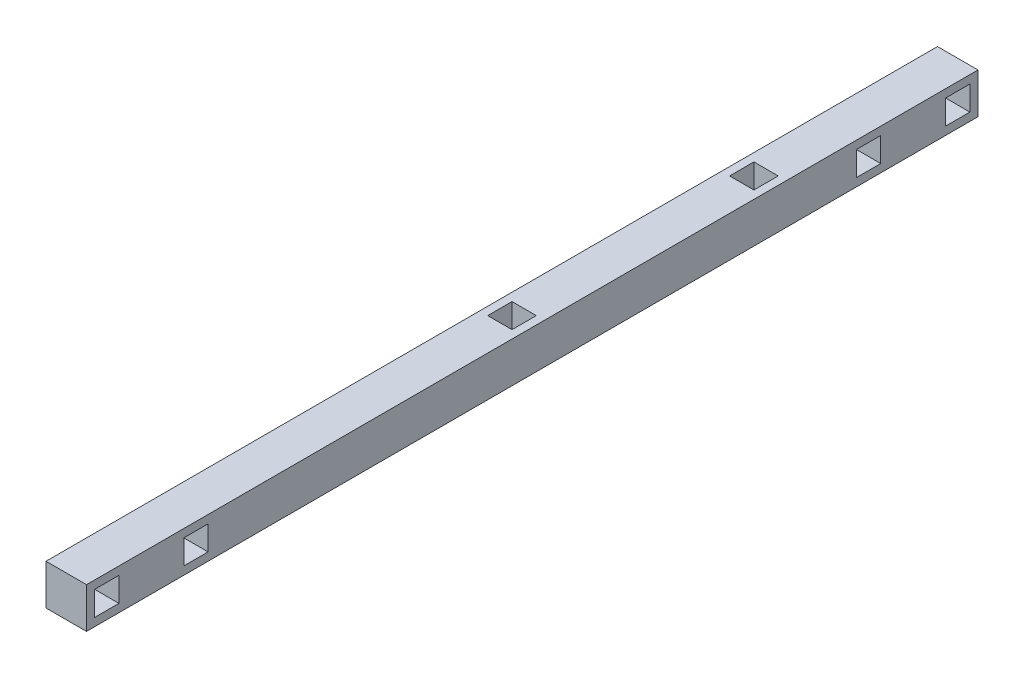
ISO-10303-21;
HEADER;
FILE_DESCRIPTION(('STEP AP214'),'2;1');
FILE_NAME('part.step','',(''),(''),'','','');
FILE_SCHEMA(('AUTOMOTIVE_DESIGN { 1 0 10303 214 1 1 1 1 }'));
ENDSEC;
DATA;
#1=APPLICATION_CONTEXT('core data for automotive mechanical design processes');
#2=APPLICATION_PROTOCOL_DEFINITION('international standard','automotive_design',2000,#1);
#3=PRODUCT_CONTEXT('',#1,'mechanical');
#4=PRODUCT('Part','Part','',(#3));
#5=PRODUCT_RELATED_PRODUCT_CATEGORY('part','',(#4));
#6=PRODUCT_DEFINITION_FORMATION('','',#4);
#7=PRODUCT_DEFINITION_CONTEXT('part definition',#1,'design');
#8=PRODUCT_DEFINITION('design','',#6,#7);
#9=PRODUCT_DEFINITION_SHAPE('','',#8);
#10=(LENGTH_UNIT() NAMED_UNIT(*) SI_UNIT(.MILLI.,.METRE.));
#11=(NAMED_UNIT(*) PLANE_ANGLE_UNIT() SI_UNIT($,.RADIAN.));
#12=(NAMED_UNIT(*) SI_UNIT($,.STERADIAN.) SOLID_ANGLE_UNIT());
#13=UNCERTAINTY_MEASURE_WITH_UNIT(LENGTH_MEASURE(1.E-05),#10,'distance_accuracy_value','');
#14=(GEOMETRIC_REPRESENTATION_CONTEXT(3) GLOBAL_UNCERTAINTY_ASSIGNED_CONTEXT((#13)) GLOBAL_UNIT_ASSIGNED_CONTEXT((#10,
#11,#12)) REPRESENTATION_CONTEXT('',''));
#15=CARTESIAN_POINT('',(0.,0.,0.));
#16=DIRECTION('',(0.,0.,1.));
#17=DIRECTION('',(1.,0.,0.));
#18=AXIS2_PLACEMENT_3D('',#15,#16,#17);
#19=CARTESIAN_POINT('',(0.,0.,110.));
#20=DIRECTION('',(1.,0.,0.));
#21=DIRECTION('',(0.,0.,-1.));
#22=AXIS2_PLACEMENT_3D('',#19,#20,#21);
#23=PLANE('',#22);
#24=DIRECTION('',(0.,0.,1.));
#25=VECTOR('',#24,1.);
#26=CARTESIAN_POINT('',(0.,1.,1.));
#27=LINE('',#26,#25);
#28=CARTESIAN_POINT('',(0.,1.,1.));
#29=VERTEX_POINT('',#28);
#30=CARTESIAN_POINT('',(0.,1.,4.));
#31=VERTEX_POINT('',#30);
#32=EDGE_CURVE('E289',#29,#31,#27,.T.);
#33=ORIENTED_EDGE('',*,*,#32,.F.);
#34=DIRECTION('',(0.,-1.,0.));
#35=VECTOR('',#34,1.);
#36=CARTESIAN_POINT('',(0.,1.,1.));
#37=LINE('',#36,#35);
#38=CARTESIAN_POINT('',(0.,4.,1.));
#39=VERTEX_POINT('',#38);
#40=EDGE_CURVE('E287',#39,#29,#37,.T.);
#41=ORIENTED_EDGE('',*,*,#40,.F.);
#42=DIRECTION('',(0.,0.,-1.));
#43=VECTOR('',#42,1.);
#44=CARTESIAN_POINT('',(0.,4.,1.));
#45=LINE('',#44,#43);
#46=CARTESIAN_POINT('',(0.,4.,4.));
#47=VERTEX_POINT('',#46);
#48=EDGE_CURVE('E296',#47,#39,#45,.T.);
#49=ORIENTED_EDGE('',*,*,#48,.F.);
#50=DIRECTION('',(0.,1.,0.));
#51=VECTOR('',#50,1.);
#52=CARTESIAN_POINT('',(0.,1.,4.));
#53=LINE('',#52,#51);
#54=EDGE_CURVE('E293',#31,#47,#53,.T.);
#55=ORIENTED_EDGE('',*,*,#54,.F.);
#56=EDGE_LOOP('',(#33,#41,#49,#55));
#57=FACE_BOUND('',#56,.T.);
#58=DIRECTION('',(0.,0.,-1.));
#59=VECTOR('',#58,1.);
#60=CARTESIAN_POINT('',(0.,4.00000000000001,98.));
#61=LINE('',#60,#59);
#62=CARTESIAN_POINT('',(0.,4.00000000000001,98.));
#63=VERTEX_POINT('',#62);
#64=CARTESIAN_POINT('',(0.,4.00000000000001,95.));
#65=VERTEX_POINT('',#64);
#66=EDGE_CURVE('E310',#63,#65,#61,.T.);
#67=ORIENTED_EDGE('',*,*,#66,.F.);
#68=DIRECTION('',(0.,1.,0.));
#69=VECTOR('',#68,1.);
#70=CARTESIAN_POINT('',(0.,4.00000000000001,98.));
#71=LINE('',#70,#69);
#72=CARTESIAN_POINT('',(0.,1.00000000000001,98.));
#73=VERTEX_POINT('',#72);
#74=EDGE_CURVE('E286',#73,#63,#71,.T.);
#75=ORIENTED_EDGE('',*,*,#74,.F.);
#76=DIRECTION('',(0.,0.,1.));
#77=VECTOR('',#76,1.);
#78=CARTESIAN_POINT('',(0.,1.00000000000001,98.));
#79=LINE('',#78,#77);
#80=CARTESIAN_POINT('',(0.,1.00000000000001,95.));
#81=VERTEX_POINT('',#80);
#82=EDGE_CURVE('E316',#81,#73,#79,.T.);
#83=ORIENTED_EDGE('',*,*,#82,.F.);
#84=DIRECTION('',(0.,-1.,0.));
#85=VECTOR('',#84,1.);
#86=CARTESIAN_POINT('',(0.,4.00000000000001,95.));
#87=LINE('',#86,#85);
#88=EDGE_CURVE('E313',#65,#81,#87,.T.);
#89=ORIENTED_EDGE('',*,*,#88,.F.);
#90=EDGE_LOOP('',(#67,#75,#83,#89));
#91=FACE_BOUND('',#90,.T.);
#92=DIRECTION('',(0.,0.,1.));
#93=VECTOR('',#92,1.);
#94=CARTESIAN_POINT('',(0.,1.,12.));
#95=LINE('',#94,#93);
#96=CARTESIAN_POINT('',(0.,1.,12.));
#97=VERTEX_POINT('',#96);
#98=CARTESIAN_POINT('',(0.,1.,15.));
#99=VERTEX_POINT('',#98);
#100=EDGE_CURVE('E350',#97,#99,#95,.T.);
#101=ORIENTED_EDGE('',*,*,#100,.F.);
#102=DIRECTION('',(0.,-1.,0.));
#103=VECTOR('',#102,1.);
#104=CARTESIAN_POINT('',(0.,4.,12.));
#105=LINE('',#104,#103);
#106=CARTESIAN_POINT('',(0.,4.,12.));
#107=VERTEX_POINT('',#106);
#108=EDGE_CURVE('E322',#107,#97,#105,.T.);
#109=ORIENTED_EDGE('',*,*,#108,.F.);
#110=DIRECTION('',(0.,0.,-1.));
#111=VECTOR('',#110,1.);
#112=CARTESIAN_POINT('',(0.,4.,12.));
#113=LINE('',#112,#111);
#114=CARTESIAN_POINT('',(0.,4.,15.));
#115=VERTEX_POINT('',#114);
#116=EDGE_CURVE('E356',#115,#107,#113,.T.);
#117=ORIENTED_EDGE('',*,*,#116,.F.);
#118=DIRECTION('',(0.,1.,0.));
#119=VECTOR('',#118,1.);
#120=CARTESIAN_POINT('',(0.,4.,15.));
#121=LINE('',#120,#119);
#122=EDGE_CURVE('E353',#99,#115,#121,.T.);
#123=ORIENTED_EDGE('',*,*,#122,.F.);
#124=EDGE_LOOP('',(#101,#109,#117,#123));
#125=FACE_BOUND('',#124,.T.);
#126=DIRECTION('',(0.,0.,-1.));
#127=VECTOR('',#126,1.);
#128=CARTESIAN_POINT('',(0.,4.,109.));
#129=LINE('',#128,#127);
#130=CARTESIAN_POINT('',(0.,4.,109.));
#131=VERTEX_POINT('',#130);
#132=CARTESIAN_POINT('',(0.,4.,106.));
#133=VERTEX_POINT('',#132);
#134=EDGE_CURVE('E331',#131,#133,#129,.T.);
#135=ORIENTED_EDGE('',*,*,#134,.F.);
#136=DIRECTION('',(0.,1.,0.));
#137=VECTOR('',#136,1.);
#138=CARTESIAN_POINT('',(0.,4.,109.));
#139=LINE('',#138,#137);
#140=CARTESIAN_POINT('',(0.,1.,109.));
#141=VERTEX_POINT('',#140);
#142=EDGE_CURVE('E329',#141,#131,#139,.T.);
#143=ORIENTED_EDGE('',*,*,#142,.F.);
#144=DIRECTION('',(0.,0.,1.));
#145=VECTOR('',#144,1.);
#146=CARTESIAN_POINT('',(0.,1.,109.));
#147=LINE('',#146,#145);
#148=CARTESIAN_POINT('',(0.,1.,106.));
#149=VERTEX_POINT('',#148);
#150=EDGE_CURVE('E338',#149,#141,#147,.T.);
#151=ORIENTED_EDGE('',*,*,#150,.F.);
#152=DIRECTION('',(0.,-1.,0.));
#153=VECTOR('',#152,1.);
#154=CARTESIAN_POINT('',(0.,4.,106.));
#155=LINE('',#154,#153);
#156=EDGE_CURVE('E335',#133,#149,#155,.T.);
#157=ORIENTED_EDGE('',*,*,#156,.F.);
#158=EDGE_LOOP('',(#135,#143,#151,#157));
#159=FACE_BOUND('',#158,.T.);
#160=DIRECTION('',(0.,-1.,0.));
#161=VECTOR('',#160,1.);
#162=CARTESIAN_POINT('',(0.,0.,0.));
#163=LINE('',#162,#161);
#164=CARTESIAN_POINT('',(0.,5.,0.));
#165=VERTEX_POINT('',#164);
#166=CARTESIAN_POINT('',(0.,0.,0.));
#167=VERTEX_POINT('',#166);
#168=EDGE_CURVE('E302',#165,#167,#163,.T.);
#169=ORIENTED_EDGE('',*,*,#168,.T.);
#170=DIRECTION('',(0.,0.,-1.));
#171=VECTOR('',#170,1.);
#172=CARTESIAN_POINT('',(0.,0.,110.));
#173=LINE('',#172,#171);
#174=CARTESIAN_POINT('',(0.,0.,110.));
#175=VERTEX_POINT('',#174);
#176=EDGE_CURVE('E393',#175,#167,#173,.T.);
#177=ORIENTED_EDGE('',*,*,#176,.F.);
#178=DIRECTION('',(0.,-1.,0.));
#179=VECTOR('',#178,1.);
#180=CARTESIAN_POINT('',(0.,0.,110.));
#181=LINE('',#180,#179);
#182=CARTESIAN_POINT('',(0.,5.,110.));
#183=VERTEX_POINT('',#182);
#184=EDGE_CURVE('E367',#183,#175,#181,.T.);
#185=ORIENTED_EDGE('',*,*,#184,.F.);
#186=DIRECTION('',(0.,0.,-1.));
#187=VECTOR('',#186,1.);
#188=CARTESIAN_POINT('',(0.,5.,110.));
#189=LINE('',#188,#187);
#190=EDGE_CURVE('E377',#183,#165,#189,.T.);
#191=ORIENTED_EDGE('',*,*,#190,.T.);
#192=EDGE_LOOP('',(#169,#177,#185,#191));
#193=FACE_BOUND('',#192,.T.);
#194=ADVANCED_FACE('F32',(#57,#91,#125,#159,#193),#23,.F.);
#195=CARTESIAN_POINT('',(0.,0.,110.));
#196=DIRECTION('',(0.,1.,0.));
#197=DIRECTION('',(0.,0.,1.));
#198=AXIS2_PLACEMENT_3D('',#195,#196,#197);
#199=PLANE('',#198);
#200=DIRECTION('',(-1.,0.,0.));
#201=VECTOR('',#200,1.);
#202=CARTESIAN_POINT('',(0.,0.,23.65));
#203=LINE('',#202,#201);
#204=CARTESIAN_POINT('',(4.,0.,23.65));
#205=VERTEX_POINT('',#204);
#206=CARTESIAN_POINT('',(0.999999999999999,0.,23.65));
#207=VERTEX_POINT('',#206);
#208=EDGE_CURVE('E280',#205,#207,#203,.T.);
#209=ORIENTED_EDGE('',*,*,#208,.T.);
#210=DIRECTION('',(0.,0.,1.));
#211=VECTOR('',#210,1.);
#212=CARTESIAN_POINT('',(1.00000000000001,0.,110.));
#213=LINE('',#212,#211);
#214=CARTESIAN_POINT('',(0.999999999999999,0.,26.65));
#215=VERTEX_POINT('',#214);
#216=EDGE_CURVE('E283',#207,#215,#213,.T.);
#217=ORIENTED_EDGE('',*,*,#216,.T.);
#218=DIRECTION('',(1.,0.,0.));
#219=VECTOR('',#218,1.);
#220=CARTESIAN_POINT('',(0.,0.,26.65));
#221=LINE('',#220,#219);
#222=CARTESIAN_POINT('',(4.,0.,26.65));
#223=VERTEX_POINT('',#222);
#224=EDGE_CURVE('E277',#215,#223,#221,.T.);
#225=ORIENTED_EDGE('',*,*,#224,.T.);
#226=DIRECTION('',(0.,0.,-1.));
#227=VECTOR('',#226,1.);
#228=CARTESIAN_POINT('',(4.00000000000005,0.,110.));
#229=LINE('',#228,#227);
#230=EDGE_CURVE('E221',#223,#205,#229,.T.);
#231=ORIENTED_EDGE('',*,*,#230,.T.);
#232=EDGE_LOOP('',(#209,#217,#225,#231));
#233=FACE_BOUND('',#232,.T.);
#234=DIRECTION('',(-1.,0.,0.));
#235=VECTOR('',#234,1.);
#236=CARTESIAN_POINT('',(0.,0.,53.5));
#237=LINE('',#236,#235);
#238=CARTESIAN_POINT('',(4.,0.,53.5));
#239=VERTEX_POINT('',#238);
#240=CARTESIAN_POINT('',(1.,0.,53.5));
#241=VERTEX_POINT('',#240);
#242=EDGE_CURVE('E271',#239,#241,#237,.T.);
#243=ORIENTED_EDGE('',*,*,#242,.T.);
#244=DIRECTION('',(0.,0.,1.));
#245=VECTOR('',#244,1.);
#246=CARTESIAN_POINT('',(1.,0.,110.));
#247=LINE('',#246,#245);
#248=CARTESIAN_POINT('',(1.,0.,56.5));
#249=VERTEX_POINT('',#248);
#250=EDGE_CURVE('E274',#241,#249,#247,.T.);
#251=ORIENTED_EDGE('',*,*,#250,.T.);
#252=DIRECTION('',(1.,0.,0.));
#253=VECTOR('',#252,1.);
#254=CARTESIAN_POINT('',(0.,0.,56.5));
#255=LINE('',#254,#253);
#256=CARTESIAN_POINT('',(4.,0.,56.5));
#257=VERTEX_POINT('',#256);
#258=EDGE_CURVE('E245',#249,#257,#255,.T.);
#259=ORIENTED_EDGE('',*,*,#258,.T.);
#260=DIRECTION('',(0.,0.,-1.));
#261=VECTOR('',#260,1.);
#262=CARTESIAN_POINT('',(4.,0.,110.));
#263=LINE('',#262,#261);
#264=EDGE_CURVE('E268',#257,#239,#263,.T.);
#265=ORIENTED_EDGE('',*,*,#264,.T.);
#266=EDGE_LOOP('',(#243,#251,#259,#265));
#267=FACE_BOUND('',#266,.T.);
#268=DIRECTION('',(1.,0.,0.));
#269=VECTOR('',#268,1.);
#270=CARTESIAN_POINT('',(0.,0.,0.));
#271=LINE('',#270,#269);
#272=CARTESIAN_POINT('',(5.,0.,0.));
#273=VERTEX_POINT('',#272);
#274=EDGE_CURVE('E380',#167,#273,#271,.T.);
#275=ORIENTED_EDGE('',*,*,#274,.T.);
#276=DIRECTION('',(0.,0.,-1.));
#277=VECTOR('',#276,1.);
#278=CARTESIAN_POINT('',(5.,0.,110.));
#279=LINE('',#278,#277);
#280=CARTESIAN_POINT('',(5.,0.,110.));
#281=VERTEX_POINT('',#280);
#282=EDGE_CURVE('E390',#281,#273,#279,.T.);
#283=ORIENTED_EDGE('',*,*,#282,.F.);
#284=DIRECTION('',(1.,0.,0.));
#285=VECTOR('',#284,1.);
#286=CARTESIAN_POINT('',(0.,0.,110.));
#287=LINE('',#286,#285);
#288=EDGE_CURVE('E370',#175,#281,#287,.T.);
#289=ORIENTED_EDGE('',*,*,#288,.F.);
#290=ORIENTED_EDGE('',*,*,#176,.T.);
#291=EDGE_LOOP('',(#275,#283,#289,#290));
#292=FACE_BOUND('',#291,.T.);
#293=ADVANCED_FACE('F472',(#233,#267,#292),#199,.F.);
#294=CARTESIAN_POINT('',(5.,0.,110.));
#295=DIRECTION('',(-1.,0.,0.));
#296=DIRECTION('',(0.,0.,1.));
#297=AXIS2_PLACEMENT_3D('',#294,#295,#296);
#298=PLANE('',#297);
#299=DIRECTION('',(0.,0.,-1.));
#300=VECTOR('',#299,1.);
#301=CARTESIAN_POINT('',(5.,4.,110.));
#302=LINE('',#301,#300);
#303=CARTESIAN_POINT('',(5.,4.,4.));
#304=VERTEX_POINT('',#303);
#305=CARTESIAN_POINT('',(5.,4.,1.));
#306=VERTEX_POINT('',#305);
#307=EDGE_CURVE('E39',#304,#306,#302,.T.);
#308=ORIENTED_EDGE('',*,*,#307,.T.);
#309=DIRECTION('',(0.,-1.,0.));
#310=VECTOR('',#309,1.);
#311=CARTESIAN_POINT('',(5.,0.,1.));
#312=LINE('',#311,#310);
#313=CARTESIAN_POINT('',(5.,1.,1.));
#314=VERTEX_POINT('',#313);
#315=EDGE_CURVE('E11',#306,#314,#312,.T.);
#316=ORIENTED_EDGE('',*,*,#315,.T.);
#317=DIRECTION('',(0.,0.,1.));
#318=VECTOR('',#317,1.);
#319=CARTESIAN_POINT('',(5.,1.,110.));
#320=LINE('',#319,#318);
#321=CARTESIAN_POINT('',(5.,1.,4.));
#322=VERTEX_POINT('',#321);
#323=EDGE_CURVE('E432',#314,#322,#320,.T.);
#324=ORIENTED_EDGE('',*,*,#323,.T.);
#325=DIRECTION('',(0.,1.,0.));
#326=VECTOR('',#325,1.);
#327=CARTESIAN_POINT('',(5.,0.,4.));
#328=LINE('',#327,#326);
#329=EDGE_CURVE('E435',#322,#304,#328,.T.);
#330=ORIENTED_EDGE('',*,*,#329,.T.);
#331=EDGE_LOOP('',(#308,#316,#324,#330));
#332=FACE_BOUND('',#331,.T.);
#333=DIRECTION('',(0.,0.,1.));
#334=VECTOR('',#333,1.);
#335=CARTESIAN_POINT('',(5.,1.00000000000001,110.));
#336=LINE('',#335,#334);
#337=CARTESIAN_POINT('',(5.,1.00000000000001,95.));
#338=VERTEX_POINT('',#337);
#339=CARTESIAN_POINT('',(5.,1.00000000000001,98.));
#340=VERTEX_POINT('',#339);
#341=EDGE_CURVE('E426',#338,#340,#336,.T.);
#342=ORIENTED_EDGE('',*,*,#341,.T.);
#343=DIRECTION('',(0.,1.,0.));
#344=VECTOR('',#343,1.);
#345=CARTESIAN_POINT('',(5.,0.,98.));
#346=LINE('',#345,#344);
#347=CARTESIAN_POINT('',(5.,4.00000000000001,98.));
#348=VERTEX_POINT('',#347);
#349=EDGE_CURVE('E429',#340,#348,#346,.T.);
#350=ORIENTED_EDGE('',*,*,#349,.T.);
#351=DIRECTION('',(0.,0.,-1.));
#352=VECTOR('',#351,1.);
#353=CARTESIAN_POINT('',(5.,4.00000000000001,110.));
#354=LINE('',#353,#352);
#355=CARTESIAN_POINT('',(5.,4.00000000000001,95.));
#356=VERTEX_POINT('',#355);
#357=EDGE_CURVE('E420',#348,#356,#354,.T.);
#358=ORIENTED_EDGE('',*,*,#357,.T.);
#359=DIRECTION('',(0.,-1.,0.));
#360=VECTOR('',#359,1.);
#361=CARTESIAN_POINT('',(5.,0.,95.));
#362=LINE('',#361,#360);
#363=EDGE_CURVE('E423',#356,#338,#362,.T.);
#364=ORIENTED_EDGE('',*,*,#363,.T.);
#365=EDGE_LOOP('',(#342,#350,#358,#364));
#366=FACE_BOUND('',#365,.T.);
#367=DIRECTION('',(0.,0.,-1.));
#368=VECTOR('',#367,1.);
#369=CARTESIAN_POINT('',(5.,4.,110.));
#370=LINE('',#369,#368);
#371=CARTESIAN_POINT('',(5.,4.,15.));
#372=VERTEX_POINT('',#371);
#373=CARTESIAN_POINT('',(5.,4.,12.));
#374=VERTEX_POINT('',#373);
#375=EDGE_CURVE('E414',#372,#374,#370,.T.);
#376=ORIENTED_EDGE('',*,*,#375,.T.);
#377=DIRECTION('',(0.,-1.,0.));
#378=VECTOR('',#377,1.);
#379=CARTESIAN_POINT('',(5.,0.,12.));
#380=LINE('',#379,#378);
#381=CARTESIAN_POINT('',(5.,1.,12.));
#382=VERTEX_POINT('',#381);
#383=EDGE_CURVE('E417',#374,#382,#380,.T.);
#384=ORIENTED_EDGE('',*,*,#383,.T.);
#385=DIRECTION('',(0.,0.,1.));
#386=VECTOR('',#385,1.);
#387=CARTESIAN_POINT('',(5.,1.,110.));
#388=LINE('',#387,#386);
#389=CARTESIAN_POINT('',(5.,1.,15.));
#390=VERTEX_POINT('',#389);
#391=EDGE_CURVE('E408',#382,#390,#388,.T.);
#392=ORIENTED_EDGE('',*,*,#391,.T.);
#393=DIRECTION('',(0.,1.,0.));
#394=VECTOR('',#393,1.);
#395=CARTESIAN_POINT('',(5.,0.,15.));
#396=LINE('',#395,#394);
#397=EDGE_CURVE('E411',#390,#372,#396,.T.);
#398=ORIENTED_EDGE('',*,*,#397,.T.);
#399=EDGE_LOOP('',(#376,#384,#392,#398));
#400=FACE_BOUND('',#399,.T.);
#401=DIRECTION('',(0.,0.,1.));
#402=VECTOR('',#401,1.);
#403=CARTESIAN_POINT('',(5.,1.,110.));
#404=LINE('',#403,#402);
#405=CARTESIAN_POINT('',(5.,1.,106.));
#406=VERTEX_POINT('',#405);
#407=CARTESIAN_POINT('',(5.,1.,109.));
#408=VERTEX_POINT('',#407);
#409=EDGE_CURVE('E402',#406,#408,#404,.T.);
#410=ORIENTED_EDGE('',*,*,#409,.T.);
#411=DIRECTION('',(0.,1.,0.));
#412=VECTOR('',#411,1.);
#413=CARTESIAN_POINT('',(5.,0.,109.));
#414=LINE('',#413,#412);
#415=CARTESIAN_POINT('',(5.,4.,109.));
#416=VERTEX_POINT('',#415);
#417=EDGE_CURVE('E405',#408,#416,#414,.T.);
#418=ORIENTED_EDGE('',*,*,#417,.T.);
#419=DIRECTION('',(0.,0.,-1.));
#420=VECTOR('',#419,1.);
#421=CARTESIAN_POINT('',(5.,4.,110.));
#422=LINE('',#421,#420);
#423=CARTESIAN_POINT('',(5.,4.,106.));
#424=VERTEX_POINT('',#423);
#425=EDGE_CURVE('E396',#416,#424,#422,.T.);
#426=ORIENTED_EDGE('',*,*,#425,.T.);
#427=DIRECTION('',(0.,-1.,0.));
#428=VECTOR('',#427,1.);
#429=CARTESIAN_POINT('',(5.,0.,106.));
#430=LINE('',#429,#428);
#431=EDGE_CURVE('E399',#424,#406,#430,.T.);
#432=ORIENTED_EDGE('',*,*,#431,.T.);
#433=EDGE_LOOP('',(#410,#418,#426,#432));
#434=FACE_BOUND('',#433,.T.);
#435=DIRECTION('',(0.,1.,0.));
#436=VECTOR('',#435,1.);
#437=CARTESIAN_POINT('',(5.,0.,0.));
#438=LINE('',#437,#436);
#439=CARTESIAN_POINT('',(5.,5.,0.));
#440=VERTEX_POINT('',#439);
#441=EDGE_CURVE('E382',#273,#440,#438,.T.);
#442=ORIENTED_EDGE('',*,*,#441,.T.);
#443=DIRECTION('',(0.,0.,-1.));
#444=VECTOR('',#443,1.);
#445=CARTESIAN_POINT('',(5.,5.,110.));
#446=LINE('',#445,#444);
#447=CARTESIAN_POINT('',(5.,5.,110.));
#448=VERTEX_POINT('',#447);
#449=EDGE_CURVE('E387',#448,#440,#446,.T.);
#450=ORIENTED_EDGE('',*,*,#449,.F.);
#451=DIRECTION('',(0.,1.,0.));
#452=VECTOR('',#451,1.);
#453=CARTESIAN_POINT('',(5.,0.,110.));
#454=LINE('',#453,#452);
#455=EDGE_CURVE('E373',#281,#448,#454,.T.);
#456=ORIENTED_EDGE('',*,*,#455,.F.);
#457=ORIENTED_EDGE('',*,*,#282,.T.);
#458=EDGE_LOOP('',(#442,#450,#456,#457));
#459=FACE_BOUND('',#458,.T.);
#460=ADVANCED_FACE('F439',(#332,#366,#400,#434,#459),#298,.F.);
#461=CARTESIAN_POINT('',(0.,5.,110.));
#462=DIRECTION('',(0.,-1.,0.));
#463=DIRECTION('',(0.,0.,-1.));
#464=AXIS2_PLACEMENT_3D('',#461,#462,#463);
#465=PLANE('',#464);
#466=DIRECTION('',(1.,0.,0.));
#467=VECTOR('',#466,1.);
#468=CARTESIAN_POINT('',(0.999999999999999,5.,26.65));
#469=LINE('',#468,#467);
#470=CARTESIAN_POINT('',(0.999999999999999,5.,26.65));
#471=VERTEX_POINT('',#470);
#472=CARTESIAN_POINT('',(4.,5.,26.65));
#473=VERTEX_POINT('',#472);
#474=EDGE_CURVE('E228',#471,#473,#469,.T.);
#475=ORIENTED_EDGE('',*,*,#474,.F.);
#476=DIRECTION('',(0.,0.,1.));
#477=VECTOR('',#476,1.);
#478=CARTESIAN_POINT('',(0.999999999999999,5.,23.65));
#479=LINE('',#478,#477);
#480=CARTESIAN_POINT('',(0.999999999999999,5.,23.65));
#481=VERTEX_POINT('',#480);
#482=EDGE_CURVE('E233',#481,#471,#479,.T.);
#483=ORIENTED_EDGE('',*,*,#482,.F.);
#484=DIRECTION('',(-1.,0.,0.));
#485=VECTOR('',#484,1.);
#486=CARTESIAN_POINT('',(0.999999999999999,5.,23.65));
#487=LINE('',#486,#485);
#488=CARTESIAN_POINT('',(4.,5.,23.65));
#489=VERTEX_POINT('',#488);
#490=EDGE_CURVE('E238',#489,#481,#487,.T.);
#491=ORIENTED_EDGE('',*,*,#490,.F.);
#492=DIRECTION('',(0.,0.,-1.));
#493=VECTOR('',#492,1.);
#494=CARTESIAN_POINT('',(4.,5.,23.65));
#495=LINE('',#494,#493);
#496=EDGE_CURVE('E218',#473,#489,#495,.T.);
#497=ORIENTED_EDGE('',*,*,#496,.F.);
#498=EDGE_LOOP('',(#475,#483,#491,#497));
#499=FACE_BOUND('',#498,.T.);
#500=DIRECTION('',(1.,0.,0.));
#501=VECTOR('',#500,1.);
#502=CARTESIAN_POINT('',(1.,5.,56.5));
#503=LINE('',#502,#501);
#504=CARTESIAN_POINT('',(1.,5.,56.5));
#505=VERTEX_POINT('',#504);
#506=CARTESIAN_POINT('',(4.,5.,56.5));
#507=VERTEX_POINT('',#506);
#508=EDGE_CURVE('E250',#505,#507,#503,.T.);
#509=ORIENTED_EDGE('',*,*,#508,.F.);
#510=DIRECTION('',(0.,0.,1.));
#511=VECTOR('',#510,1.);
#512=CARTESIAN_POINT('',(1.,5.,53.5));
#513=LINE('',#512,#511);
#514=CARTESIAN_POINT('',(1.,5.,53.5));
#515=VERTEX_POINT('',#514);
#516=EDGE_CURVE('E248',#515,#505,#513,.T.);
#517=ORIENTED_EDGE('',*,*,#516,.F.);
#518=DIRECTION('',(-1.,0.,0.));
#519=VECTOR('',#518,1.);
#520=CARTESIAN_POINT('',(1.,5.,53.5));
#521=LINE('',#520,#519);
#522=CARTESIAN_POINT('',(4.,5.,53.5));
#523=VERTEX_POINT('',#522);
#524=EDGE_CURVE('E255',#523,#515,#521,.T.);
#525=ORIENTED_EDGE('',*,*,#524,.F.);
#526=DIRECTION('',(0.,0.,-1.));
#527=VECTOR('',#526,1.);
#528=CARTESIAN_POINT('',(4.,5.,53.5));
#529=LINE('',#528,#527);
#530=EDGE_CURVE('E252',#507,#523,#529,.T.);
#531=ORIENTED_EDGE('',*,*,#530,.F.);
#532=EDGE_LOOP('',(#509,#517,#525,#531));
#533=FACE_BOUND('',#532,.T.);
#534=DIRECTION('',(-1.,0.,0.));
#535=VECTOR('',#534,1.);
#536=CARTESIAN_POINT('',(0.,5.,0.));
#537=LINE('',#536,#535);
#538=EDGE_CURVE('E371',#440,#165,#537,.T.);
#539=ORIENTED_EDGE('',*,*,#538,.T.);
#540=ORIENTED_EDGE('',*,*,#190,.F.);
#541=DIRECTION('',(-1.,0.,0.));
#542=VECTOR('',#541,1.);
#543=CARTESIAN_POINT('',(0.,5.,110.));
#544=LINE('',#543,#542);
#545=EDGE_CURVE('E375',#448,#183,#544,.T.);
#546=ORIENTED_EDGE('',*,*,#545,.F.);
#547=ORIENTED_EDGE('',*,*,#449,.T.);
#548=EDGE_LOOP('',(#539,#540,#546,#547));
#549=FACE_BOUND('',#548,.T.);
#550=ADVANCED_FACE('F235',(#499,#533,#549),#465,.F.);
#551=CARTESIAN_POINT('',(0.,0.,110.));
#552=DIRECTION('',(0.,0.,-1.));
#553=DIRECTION('',(-1.,0.,0.));
#554=AXIS2_PLACEMENT_3D('',#551,#552,#553);
#555=PLANE('',#554);
#556=ORIENTED_EDGE('',*,*,#184,.T.);
#557=ORIENTED_EDGE('',*,*,#288,.T.);
#558=ORIENTED_EDGE('',*,*,#455,.T.);
#559=ORIENTED_EDGE('',*,*,#545,.T.);
#560=EDGE_LOOP('',(#556,#557,#558,#559));
#561=FACE_BOUND('',#560,.T.);
#562=ADVANCED_FACE('F486',(#561),#555,.F.);
#563=CARTESIAN_POINT('',(0.,0.,0.));
#564=DIRECTION('',(0.,0.,-1.));
#565=DIRECTION('',(-1.,0.,0.));
#566=AXIS2_PLACEMENT_3D('',#563,#564,#565);
#567=PLANE('',#566);
#568=ORIENTED_EDGE('',*,*,#168,.F.);
#569=ORIENTED_EDGE('',*,*,#538,.F.);
#570=ORIENTED_EDGE('',*,*,#441,.F.);
#571=ORIENTED_EDGE('',*,*,#274,.F.);
#572=EDGE_LOOP('',(#568,#569,#570,#571));
#573=FACE_BOUND('',#572,.T.);
#574=ADVANCED_FACE('F487',(#573),#567,.T.);
#575=CARTESIAN_POINT('',(8.99999999999995,4.,109.));
#576=DIRECTION('',(0.,0.,1.));
#577=DIRECTION('',(0.,-1.,0.));
#578=AXIS2_PLACEMENT_3D('',#575,#576,#577);
#579=PLANE('',#578);
#580=DIRECTION('',(-1.,0.,0.));
#581=VECTOR('',#580,1.);
#582=CARTESIAN_POINT('',(8.99999999999995,1.,109.));
#583=LINE('',#582,#581);
#584=EDGE_CURVE('E290',#408,#141,#583,.T.);
#585=ORIENTED_EDGE('',*,*,#584,.T.);
#586=ORIENTED_EDGE('',*,*,#142,.T.);
#587=DIRECTION('',(-1.,0.,0.));
#588=VECTOR('',#587,1.);
#589=CARTESIAN_POINT('',(8.99999999999995,4.,109.));
#590=LINE('',#589,#588);
#591=EDGE_CURVE('E341',#416,#131,#590,.T.);
#592=ORIENTED_EDGE('',*,*,#591,.F.);
#593=ORIENTED_EDGE('',*,*,#417,.F.);
#594=EDGE_LOOP('',(#585,#586,#592,#593));
#595=FACE_BOUND('',#594,.T.);
#596=ADVANCED_FACE('F490',(#595),#579,.F.);
#597=CARTESIAN_POINT('',(8.99999999999995,1.,109.));
#598=DIRECTION('',(0.,-1.,0.));
#599=DIRECTION('',(0.,0.,-1.));
#600=AXIS2_PLACEMENT_3D('',#597,#598,#599);
#601=PLANE('',#600);
#602=DIRECTION('',(-1.,0.,0.));
#603=VECTOR('',#602,1.);
#604=CARTESIAN_POINT('',(8.99999999999995,1.,106.));
#605=LINE('',#604,#603);
#606=EDGE_CURVE('E343',#406,#149,#605,.T.);
#607=ORIENTED_EDGE('',*,*,#606,.T.);
#608=ORIENTED_EDGE('',*,*,#150,.T.);
#609=ORIENTED_EDGE('',*,*,#584,.F.);
#610=ORIENTED_EDGE('',*,*,#409,.F.);
#611=EDGE_LOOP('',(#607,#608,#609,#610));
#612=FACE_BOUND('',#611,.T.);
#613=ADVANCED_FACE('F515',(#612),#601,.F.);
#614=CARTESIAN_POINT('',(8.99999999999995,4.,106.));
#615=DIRECTION('',(0.,0.,-1.));
#616=DIRECTION('',(-1.,0.,0.));
#617=AXIS2_PLACEMENT_3D('',#614,#615,#616);
#618=PLANE('',#617);
#619=DIRECTION('',(-1.,0.,0.));
#620=VECTOR('',#619,1.);
#621=CARTESIAN_POINT('',(8.99999999999995,4.,106.));
#622=LINE('',#621,#620);
#623=EDGE_CURVE('E345',#424,#133,#622,.T.);
#624=ORIENTED_EDGE('',*,*,#623,.T.);
#625=ORIENTED_EDGE('',*,*,#156,.T.);
#626=ORIENTED_EDGE('',*,*,#606,.F.);
#627=ORIENTED_EDGE('',*,*,#431,.F.);
#628=EDGE_LOOP('',(#624,#625,#626,#627));
#629=FACE_BOUND('',#628,.T.);
#630=ADVANCED_FACE('F519',(#629),#618,.F.);
#631=CARTESIAN_POINT('',(8.99999999999995,4.,109.));
#632=DIRECTION('',(0.,1.,0.));
#633=DIRECTION('',(0.,0.,1.));
#634=AXIS2_PLACEMENT_3D('',#631,#632,#633);
#635=PLANE('',#634);
#636=ORIENTED_EDGE('',*,*,#591,.T.);
#637=ORIENTED_EDGE('',*,*,#134,.T.);
#638=ORIENTED_EDGE('',*,*,#623,.F.);
#639=ORIENTED_EDGE('',*,*,#425,.F.);
#640=EDGE_LOOP('',(#636,#637,#638,#639));
#641=FACE_BOUND('',#640,.T.);
#642=ADVANCED_FACE('F499',(#641),#635,.F.);
#643=CARTESIAN_POINT('',(8.99999999999995,4.,12.));
#644=DIRECTION('',(0.,0.,-1.));
#645=DIRECTION('',(-1.,0.,0.));
#646=AXIS2_PLACEMENT_3D('',#643,#644,#645);
#647=PLANE('',#646);
#648=DIRECTION('',(-1.,0.,0.));
#649=VECTOR('',#648,1.);
#650=CARTESIAN_POINT('',(8.99999999999995,4.,12.));
#651=LINE('',#650,#649);
#652=EDGE_CURVE('E332',#374,#107,#651,.T.);
#653=ORIENTED_EDGE('',*,*,#652,.T.);
#654=ORIENTED_EDGE('',*,*,#108,.T.);
#655=DIRECTION('',(-1.,0.,0.));
#656=VECTOR('',#655,1.);
#657=CARTESIAN_POINT('',(8.99999999999995,1.,12.));
#658=LINE('',#657,#656);
#659=EDGE_CURVE('E359',#382,#97,#658,.T.);
#660=ORIENTED_EDGE('',*,*,#659,.F.);
#661=ORIENTED_EDGE('',*,*,#383,.F.);
#662=EDGE_LOOP('',(#653,#654,#660,#661));
#663=FACE_BOUND('',#662,.T.);
#664=ADVANCED_FACE('F495',(#663),#647,.F.);
#665=CARTESIAN_POINT('',(8.99999999999995,4.,12.));
#666=DIRECTION('',(0.,1.,0.));
#667=DIRECTION('',(0.,0.,1.));
#668=AXIS2_PLACEMENT_3D('',#665,#666,#667);
#669=PLANE('',#668);
#670=DIRECTION('',(-1.,0.,0.));
#671=VECTOR('',#670,1.);
#672=CARTESIAN_POINT('',(8.99999999999995,4.,15.));
#673=LINE('',#672,#671);
#674=EDGE_CURVE('E361',#372,#115,#673,.T.);
#675=ORIENTED_EDGE('',*,*,#674,.T.);
#676=ORIENTED_EDGE('',*,*,#116,.T.);
#677=ORIENTED_EDGE('',*,*,#652,.F.);
#678=ORIENTED_EDGE('',*,*,#375,.F.);
#679=EDGE_LOOP('',(#675,#676,#677,#678));
#680=FACE_BOUND('',#679,.T.);
#681=ADVANCED_FACE('F498',(#680),#669,.F.);
#682=CARTESIAN_POINT('',(8.99999999999995,4.,15.));
#683=DIRECTION('',(0.,0.,1.));
#684=DIRECTION('',(1.,0.,0.));
#685=AXIS2_PLACEMENT_3D('',#682,#683,#684);
#686=PLANE('',#685);
#687=DIRECTION('',(-1.,0.,0.));
#688=VECTOR('',#687,1.);
#689=CARTESIAN_POINT('',(8.99999999999995,1.,15.));
#690=LINE('',#689,#688);
#691=EDGE_CURVE('E363',#390,#99,#690,.T.);
#692=ORIENTED_EDGE('',*,*,#691,.T.);
#693=ORIENTED_EDGE('',*,*,#122,.T.);
#694=ORIENTED_EDGE('',*,*,#674,.F.);
#695=ORIENTED_EDGE('',*,*,#397,.F.);
#696=EDGE_LOOP('',(#692,#693,#694,#695));
#697=FACE_BOUND('',#696,.T.);
#698=ADVANCED_FACE('F505',(#697),#686,.F.);
#699=CARTESIAN_POINT('',(8.99999999999995,1.,12.));
#700=DIRECTION('',(0.,-1.,0.));
#701=DIRECTION('',(0.,0.,-1.));
#702=AXIS2_PLACEMENT_3D('',#699,#700,#701);
#703=PLANE('',#702);
#704=ORIENTED_EDGE('',*,*,#659,.T.);
#705=ORIENTED_EDGE('',*,*,#100,.T.);
#706=ORIENTED_EDGE('',*,*,#691,.F.);
#707=ORIENTED_EDGE('',*,*,#391,.F.);
#708=EDGE_LOOP('',(#704,#705,#706,#707));
#709=FACE_BOUND('',#708,.T.);
#710=ADVANCED_FACE('F501',(#709),#703,.F.);
#711=CARTESIAN_POINT('',(8.99999999999995,4.00000000000001,98.));
#712=DIRECTION('',(0.,0.,1.));
#713=DIRECTION('',(1.,0.,0.));
#714=AXIS2_PLACEMENT_3D('',#711,#712,#713);
#715=PLANE('',#714);
#716=DIRECTION('',(-1.,0.,0.));
#717=VECTOR('',#716,1.);
#718=CARTESIAN_POINT('',(8.99999999999995,1.00000000000001,98.));
#719=LINE('',#718,#717);
#720=EDGE_CURVE('E320',#340,#73,#719,.T.);
#721=ORIENTED_EDGE('',*,*,#720,.T.);
#722=ORIENTED_EDGE('',*,*,#74,.T.);
#723=DIRECTION('',(-1.,0.,0.));
#724=VECTOR('',#723,1.);
#725=CARTESIAN_POINT('',(8.99999999999995,4.00000000000001,98.));
#726=LINE('',#725,#724);
#727=EDGE_CURVE('E319',#348,#63,#726,.T.);
#728=ORIENTED_EDGE('',*,*,#727,.F.);
#729=ORIENTED_EDGE('',*,*,#349,.F.);
#730=EDGE_LOOP('',(#721,#722,#728,#729));
#731=FACE_BOUND('',#730,.T.);
#732=ADVANCED_FACE('F504',(#731),#715,.F.);
#733=CARTESIAN_POINT('',(8.99999999999995,1.00000000000001,98.));
#734=DIRECTION('',(0.,-1.,0.));
#735=DIRECTION('',(0.,0.,-1.));
#736=AXIS2_PLACEMENT_3D('',#733,#734,#735);
#737=PLANE('',#736);
#738=DIRECTION('',(-1.,0.,0.));
#739=VECTOR('',#738,1.);
#740=CARTESIAN_POINT('',(8.99999999999995,1.00000000000001,95.));
#741=LINE('',#740,#739);
#742=EDGE_CURVE('E323',#338,#81,#741,.T.);
#743=ORIENTED_EDGE('',*,*,#742,.T.);
#744=ORIENTED_EDGE('',*,*,#82,.T.);
#745=ORIENTED_EDGE('',*,*,#720,.F.);
#746=ORIENTED_EDGE('',*,*,#341,.F.);
#747=EDGE_LOOP('',(#743,#744,#745,#746));
#748=FACE_BOUND('',#747,.T.);
#749=ADVANCED_FACE('F529',(#748),#737,.F.);
#750=CARTESIAN_POINT('',(8.99999999999995,4.00000000000001,95.));
#751=DIRECTION('',(0.,0.,-1.));
#752=DIRECTION('',(-1.,0.,0.));
#753=AXIS2_PLACEMENT_3D('',#750,#751,#752);
#754=PLANE('',#753);
#755=DIRECTION('',(-1.,0.,0.));
#756=VECTOR('',#755,1.);
#757=CARTESIAN_POINT('',(8.99999999999995,4.00000000000001,95.));
#758=LINE('',#757,#756);
#759=EDGE_CURVE('E325',#356,#65,#758,.T.);
#760=ORIENTED_EDGE('',*,*,#759,.T.);
#761=ORIENTED_EDGE('',*,*,#88,.T.);
#762=ORIENTED_EDGE('',*,*,#742,.F.);
#763=ORIENTED_EDGE('',*,*,#363,.F.);
#764=EDGE_LOOP('',(#760,#761,#762,#763));
#765=FACE_BOUND('',#764,.T.);
#766=ADVANCED_FACE('F534',(#765),#754,.F.);
#767=CARTESIAN_POINT('',(8.99999999999995,4.00000000000001,98.));
#768=DIRECTION('',(0.,1.,0.));
#769=DIRECTION('',(0.,0.,1.));
#770=AXIS2_PLACEMENT_3D('',#767,#768,#769);
#771=PLANE('',#770);
#772=ORIENTED_EDGE('',*,*,#727,.T.);
#773=ORIENTED_EDGE('',*,*,#66,.T.);
#774=ORIENTED_EDGE('',*,*,#759,.F.);
#775=ORIENTED_EDGE('',*,*,#357,.F.);
#776=EDGE_LOOP('',(#772,#773,#774,#775));
#777=FACE_BOUND('',#776,.T.);
#778=ADVANCED_FACE('F531',(#777),#771,.F.);
#779=CARTESIAN_POINT('',(8.99999999999995,1.,1.));
#780=DIRECTION('',(0.,0.,-1.));
#781=DIRECTION('',(-1.,0.,0.));
#782=AXIS2_PLACEMENT_3D('',#779,#780,#781);
#783=PLANE('',#782);
#784=DIRECTION('',(-1.,0.,0.));
#785=VECTOR('',#784,1.);
#786=CARTESIAN_POINT('',(8.99999999999995,4.,1.));
#787=LINE('',#786,#785);
#788=EDGE_CURVE('E300',#306,#39,#787,.T.);
#789=ORIENTED_EDGE('',*,*,#788,.T.);
#790=ORIENTED_EDGE('',*,*,#40,.T.);
#791=DIRECTION('',(-1.,0.,0.));
#792=VECTOR('',#791,1.);
#793=CARTESIAN_POINT('',(8.99999999999995,1.,1.));
#794=LINE('',#793,#792);
#795=EDGE_CURVE('E299',#314,#29,#794,.T.);
#796=ORIENTED_EDGE('',*,*,#795,.F.);
#797=ORIENTED_EDGE('',*,*,#315,.F.);
#798=EDGE_LOOP('',(#789,#790,#796,#797));
#799=FACE_BOUND('',#798,.T.);
#800=ADVANCED_FACE('F456',(#799),#783,.F.);
#801=CARTESIAN_POINT('',(8.99999999999995,4.,1.));
#802=DIRECTION('',(0.,1.,0.));
#803=DIRECTION('',(0.,0.,1.));
#804=AXIS2_PLACEMENT_3D('',#801,#802,#803);
#805=PLANE('',#804);
#806=DIRECTION('',(-1.,0.,0.));
#807=VECTOR('',#806,1.);
#808=CARTESIAN_POINT('',(8.99999999999995,4.,4.));
#809=LINE('',#808,#807);
#810=EDGE_CURVE('E303',#304,#47,#809,.T.);
#811=ORIENTED_EDGE('',*,*,#810,.T.);
#812=ORIENTED_EDGE('',*,*,#48,.T.);
#813=ORIENTED_EDGE('',*,*,#788,.F.);
#814=ORIENTED_EDGE('',*,*,#307,.F.);
#815=EDGE_LOOP('',(#811,#812,#813,#814));
#816=FACE_BOUND('',#815,.T.);
#817=ADVANCED_FACE('F445',(#816),#805,.F.);
#818=CARTESIAN_POINT('',(8.99999999999995,1.,4.));
#819=DIRECTION('',(0.,0.,1.));
#820=DIRECTION('',(1.,0.,0.));
#821=AXIS2_PLACEMENT_3D('',#818,#819,#820);
#822=PLANE('',#821);
#823=DIRECTION('',(-1.,0.,0.));
#824=VECTOR('',#823,1.);
#825=CARTESIAN_POINT('',(8.99999999999995,1.,4.));
#826=LINE('',#825,#824);
#827=EDGE_CURVE('E305',#322,#31,#826,.T.);
#828=ORIENTED_EDGE('',*,*,#827,.T.);
#829=ORIENTED_EDGE('',*,*,#54,.T.);
#830=ORIENTED_EDGE('',*,*,#810,.F.);
#831=ORIENTED_EDGE('',*,*,#329,.F.);
#832=EDGE_LOOP('',(#828,#829,#830,#831));
#833=FACE_BOUND('',#832,.T.);
#834=ADVANCED_FACE('F447',(#833),#822,.F.);
#835=CARTESIAN_POINT('',(8.99999999999995,1.,1.));
#836=DIRECTION('',(0.,-1.,0.));
#837=DIRECTION('',(0.,0.,-1.));
#838=AXIS2_PLACEMENT_3D('',#835,#836,#837);
#839=PLANE('',#838);
#840=ORIENTED_EDGE('',*,*,#795,.T.);
#841=ORIENTED_EDGE('',*,*,#32,.T.);
#842=ORIENTED_EDGE('',*,*,#827,.F.);
#843=ORIENTED_EDGE('',*,*,#323,.F.);
#844=EDGE_LOOP('',(#840,#841,#842,#843));
#845=FACE_BOUND('',#844,.T.);
#846=ADVANCED_FACE('F458',(#845),#839,.F.);
#847=CARTESIAN_POINT('',(1.,-3.99999999999995,53.5));
#848=DIRECTION('',(-1.,0.,0.));
#849=DIRECTION('',(0.,0.,1.));
#850=AXIS2_PLACEMENT_3D('',#847,#848,#849);
#851=PLANE('',#850);
#852=DIRECTION('',(0.,1.,0.));
#853=VECTOR('',#852,1.);
#854=CARTESIAN_POINT('',(1.,-3.99999999999995,53.5));
#855=LINE('',#854,#853);
#856=EDGE_CURVE('E259',#241,#515,#855,.T.);
#857=ORIENTED_EDGE('',*,*,#856,.T.);
#858=ORIENTED_EDGE('',*,*,#516,.T.);
#859=DIRECTION('',(0.,1.,0.));
#860=VECTOR('',#859,1.);
#861=CARTESIAN_POINT('',(1.,-3.99999999999995,56.5));
#862=LINE('',#861,#860);
#863=EDGE_CURVE('E258',#249,#505,#862,.T.);
#864=ORIENTED_EDGE('',*,*,#863,.F.);
#865=ORIENTED_EDGE('',*,*,#250,.F.);
#866=EDGE_LOOP('',(#857,#858,#864,#865));
#867=FACE_BOUND('',#866,.T.);
#868=ADVANCED_FACE('F460',(#867),#851,.F.);
#869=CARTESIAN_POINT('',(1.,-3.99999999999995,53.5));
#870=DIRECTION('',(0.,0.,-1.));
#871=DIRECTION('',(-1.,0.,0.));
#872=AXIS2_PLACEMENT_3D('',#869,#870,#871);
#873=PLANE('',#872);
#874=DIRECTION('',(0.,1.,0.));
#875=VECTOR('',#874,1.);
#876=CARTESIAN_POINT('',(4.,-3.99999999999995,53.5));
#877=LINE('',#876,#875);
#878=EDGE_CURVE('E261',#239,#523,#877,.T.);
#879=ORIENTED_EDGE('',*,*,#878,.T.);
#880=ORIENTED_EDGE('',*,*,#524,.T.);
#881=ORIENTED_EDGE('',*,*,#856,.F.);
#882=ORIENTED_EDGE('',*,*,#242,.F.);
#883=EDGE_LOOP('',(#879,#880,#881,#882));
#884=FACE_BOUND('',#883,.T.);
#885=ADVANCED_FACE('F466',(#884),#873,.F.);
#886=CARTESIAN_POINT('',(4.,-3.99999999999995,53.5));
#887=DIRECTION('',(1.,0.,0.));
#888=DIRECTION('',(0.,0.,-1.));
#889=AXIS2_PLACEMENT_3D('',#886,#887,#888);
#890=PLANE('',#889);
#891=DIRECTION('',(0.,1.,0.));
#892=VECTOR('',#891,1.);
#893=CARTESIAN_POINT('',(4.,-3.99999999999995,56.5));
#894=LINE('',#893,#892);
#895=EDGE_CURVE('E54',#257,#507,#894,.T.);
#896=ORIENTED_EDGE('',*,*,#895,.T.);
#897=ORIENTED_EDGE('',*,*,#530,.T.);
#898=ORIENTED_EDGE('',*,*,#878,.F.);
#899=ORIENTED_EDGE('',*,*,#264,.F.);
#900=EDGE_LOOP('',(#896,#897,#898,#899));
#901=FACE_BOUND('',#900,.T.);
#902=ADVANCED_FACE('F553',(#901),#890,.F.);
#903=CARTESIAN_POINT('',(1.,-3.99999999999995,56.5));
#904=DIRECTION('',(0.,0.,1.));
#905=DIRECTION('',(1.,0.,0.));
#906=AXIS2_PLACEMENT_3D('',#903,#904,#905);
#907=PLANE('',#906);
#908=ORIENTED_EDGE('',*,*,#863,.T.);
#909=ORIENTED_EDGE('',*,*,#508,.T.);
#910=ORIENTED_EDGE('',*,*,#895,.F.);
#911=ORIENTED_EDGE('',*,*,#258,.F.);
#912=EDGE_LOOP('',(#908,#909,#910,#911));
#913=FACE_BOUND('',#912,.T.);
#914=ADVANCED_FACE('F549',(#913),#907,.F.);
#915=CARTESIAN_POINT('',(0.999999999999999,-3.99999999999995,23.65));
#916=DIRECTION('',(-1.,0.,0.));
#917=DIRECTION('',(0.,0.,1.));
#918=AXIS2_PLACEMENT_3D('',#915,#916,#917);
#919=PLANE('',#918);
#920=DIRECTION('',(0.,1.,0.));
#921=VECTOR('',#920,1.);
#922=CARTESIAN_POINT('',(0.999999999999999,-3.99999999999995,23.65));
#923=LINE('',#922,#921);
#924=EDGE_CURVE('E243',#207,#481,#923,.T.);
#925=ORIENTED_EDGE('',*,*,#924,.T.);
#926=ORIENTED_EDGE('',*,*,#482,.T.);
#927=DIRECTION('',(0.,1.,0.));
#928=VECTOR('',#927,1.);
#929=CARTESIAN_POINT('',(0.999999999999999,-3.99999999999995,26.65));
#930=LINE('',#929,#928);
#931=EDGE_CURVE('E224',#215,#471,#930,.T.);
#932=ORIENTED_EDGE('',*,*,#931,.F.);
#933=ORIENTED_EDGE('',*,*,#216,.F.);
#934=EDGE_LOOP('',(#925,#926,#932,#933));
#935=FACE_BOUND('',#934,.T.);
#936=ADVANCED_FACE('F552',(#935),#919,.F.);
#937=CARTESIAN_POINT('',(0.999999999999999,-3.99999999999995,23.65));
#938=DIRECTION('',(0.,0.,-1.));
#939=DIRECTION('',(-1.,0.,0.));
#940=AXIS2_PLACEMENT_3D('',#937,#938,#939);
#941=PLANE('',#940);
#942=DIRECTION('',(0.,1.,0.));
#943=VECTOR('',#942,1.);
#944=CARTESIAN_POINT('',(4.,-3.99999999999995,23.65));
#945=LINE('',#944,#943);
#946=EDGE_CURVE('E223',#205,#489,#945,.T.);
#947=ORIENTED_EDGE('',*,*,#946,.T.);
#948=ORIENTED_EDGE('',*,*,#490,.T.);
#949=ORIENTED_EDGE('',*,*,#924,.F.);
#950=ORIENTED_EDGE('',*,*,#208,.F.);
#951=EDGE_LOOP('',(#947,#948,#949,#950));
#952=FACE_BOUND('',#951,.T.);
#953=ADVANCED_FACE('F562',(#952),#941,.F.);
#954=CARTESIAN_POINT('',(4.,-3.99999999999995,23.65));
#955=DIRECTION('',(1.,0.,0.));
#956=DIRECTION('',(0.,0.,-1.));
#957=AXIS2_PLACEMENT_3D('',#954,#955,#956);
#958=PLANE('',#957);
#959=DIRECTION('',(0.,1.,0.));
#960=VECTOR('',#959,1.);
#961=CARTESIAN_POINT('',(4.,-3.99999999999995,26.65));
#962=LINE('',#961,#960);
#963=EDGE_CURVE('E46',#223,#473,#962,.T.);
#964=ORIENTED_EDGE('',*,*,#963,.T.);
#965=ORIENTED_EDGE('',*,*,#496,.T.);
#966=ORIENTED_EDGE('',*,*,#946,.F.);
#967=ORIENTED_EDGE('',*,*,#230,.F.);
#968=EDGE_LOOP('',(#964,#965,#966,#967));
#969=FACE_BOUND('',#968,.T.);
#970=ADVANCED_FACE('F215',(#969),#958,.F.);
#971=CARTESIAN_POINT('',(0.999999999999999,-3.99999999999995,26.65));
#972=DIRECTION('',(0.,0.,1.));
#973=DIRECTION('',(1.,0.,0.));
#974=AXIS2_PLACEMENT_3D('',#971,#972,#973);
#975=PLANE('',#974);
#976=ORIENTED_EDGE('',*,*,#931,.T.);
#977=ORIENTED_EDGE('',*,*,#474,.T.);
#978=ORIENTED_EDGE('',*,*,#963,.F.);
#979=ORIENTED_EDGE('',*,*,#224,.F.);
#980=EDGE_LOOP('',(#976,#977,#978,#979));
#981=FACE_BOUND('',#980,.T.);
#982=ADVANCED_FACE('F229',(#981),#975,.F.);
#983=CLOSED_SHELL('',(#194,#293,#460,#550,#562,#574,#596,#613,#630,#642,#664,#681,#698,#710,
#732,#749,#766,#778,#800,#817,#834,#846,#868,#885,#902,#914,#936,#953,#970,#982));
#984=MANIFOLD_SOLID_BREP('B2',#983);
#985=ADVANCED_BREP_SHAPE_REPRESENTATION('',(#18,#984),#14);
#986=SHAPE_DEFINITION_REPRESENTATION(#9,#985);
ENDSEC;
END-ISO-10303-21;
